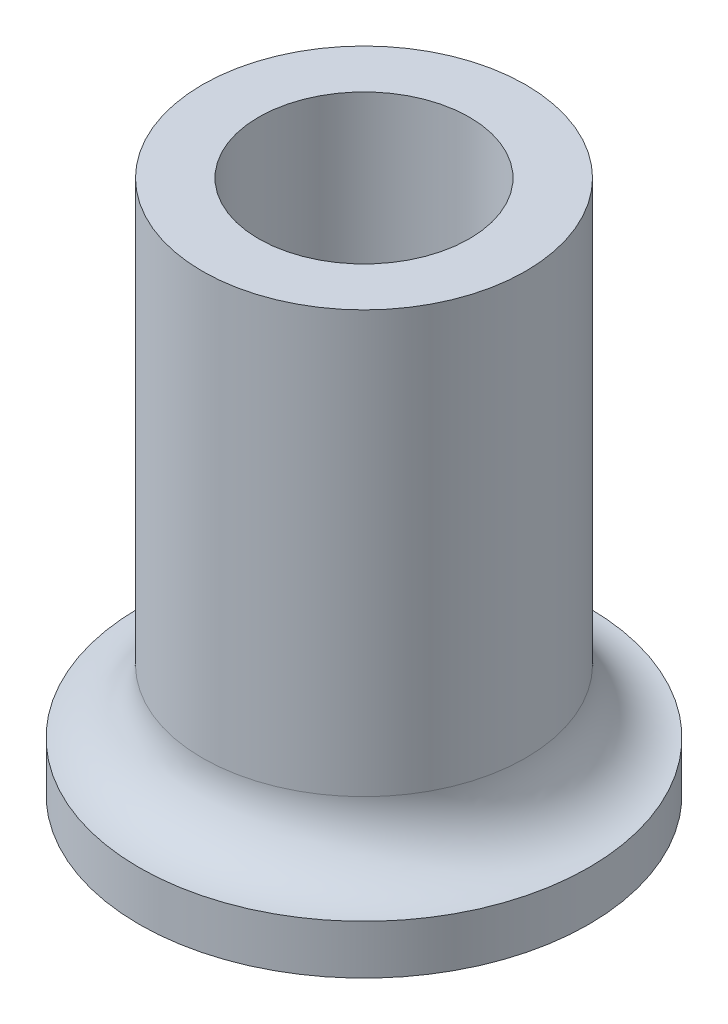
ISO-10303-21;
HEADER;
FILE_DESCRIPTION(('STEP AP214'),'2;1');
FILE_NAME('part.step','',(''),(''),'','','');
FILE_SCHEMA(('AUTOMOTIVE_DESIGN { 1 0 10303 214 1 1 1 1 }'));
ENDSEC;
DATA;
#1=APPLICATION_CONTEXT('core data for automotive mechanical design processes');
#2=APPLICATION_PROTOCOL_DEFINITION('international standard','automotive_design',2000,#1);
#3=PRODUCT_CONTEXT('',#1,'mechanical');
#4=PRODUCT('Part','Part','',(#3));
#5=PRODUCT_RELATED_PRODUCT_CATEGORY('part','',(#4));
#6=PRODUCT_DEFINITION_FORMATION('','',#4);
#7=PRODUCT_DEFINITION_CONTEXT('part definition',#1,'design');
#8=PRODUCT_DEFINITION('design','',#6,#7);
#9=PRODUCT_DEFINITION_SHAPE('','',#8);
#10=(LENGTH_UNIT() NAMED_UNIT(*) SI_UNIT(.MILLI.,.METRE.));
#11=(NAMED_UNIT(*) PLANE_ANGLE_UNIT() SI_UNIT($,.RADIAN.));
#12=(NAMED_UNIT(*) SI_UNIT($,.STERADIAN.) SOLID_ANGLE_UNIT());
#13=UNCERTAINTY_MEASURE_WITH_UNIT(LENGTH_MEASURE(1.E-05),#10,'distance_accuracy_value','');
#14=(GEOMETRIC_REPRESENTATION_CONTEXT(3) GLOBAL_UNCERTAINTY_ASSIGNED_CONTEXT((#13)) GLOBAL_UNIT_ASSIGNED_CONTEXT((#10,
#11,#12)) REPRESENTATION_CONTEXT('',''));
#15=CARTESIAN_POINT('',(0.,0.,0.));
#16=DIRECTION('',(0.,0.,1.));
#17=DIRECTION('',(1.,0.,0.));
#18=AXIS2_PLACEMENT_3D('',#15,#16,#17);
#19=CARTESIAN_POINT('',(0.,0.,0.));
#20=DIRECTION('',(0.,1.,0.));
#21=DIRECTION('',(0.,0.,1.));
#22=AXIS2_PLACEMENT_3D('',#19,#20,#21);
#23=PLANE('',#22);
#24=CARTESIAN_POINT('',(0.,0.,0.));
#25=DIRECTION('',(0.,1.,0.));
#26=DIRECTION('',(0.,0.,1.));
#27=AXIS2_PLACEMENT_3D('',#24,#25,#26);
#28=CIRCLE('',#27,16.);
#29=CARTESIAN_POINT('',(0.,0.,16.));
#30=VERTEX_POINT('',#29);
#31=EDGE_CURVE('E50',#30,#30,#28,.T.);
#32=ORIENTED_EDGE('',*,*,#31,.F.);
#33=EDGE_LOOP('',(#32));
#34=FACE_BOUND('',#33,.T.);
#35=CARTESIAN_POINT('',(0.,0.,0.));
#36=DIRECTION('',(0.,1.,0.));
#37=DIRECTION('',(0.,0.,1.));
#38=AXIS2_PLACEMENT_3D('',#35,#36,#37);
#39=CIRCLE('',#38,7.5);
#40=CARTESIAN_POINT('',(0.,0.,7.5));
#41=VERTEX_POINT('',#40);
#42=EDGE_CURVE('E56',#41,#41,#39,.T.);
#43=ORIENTED_EDGE('',*,*,#42,.T.);
#44=EDGE_LOOP('',(#43));
#45=FACE_BOUND('',#44,.T.);
#46=ADVANCED_FACE('F37',(#34,#45),#23,.F.);
#47=CARTESIAN_POINT('',(0.,3.5,0.));
#48=DIRECTION('',(0.,-1.,0.));
#49=DIRECTION('',(0.,0.,-1.));
#50=AXIS2_PLACEMENT_3D('',#47,#48,#49);
#51=CYLINDRICAL_SURFACE('',#50,16.);
#52=CARTESIAN_POINT('',(0.,3.5,0.));
#53=DIRECTION('',(0.,1.,0.));
#54=DIRECTION('',(0.,0.,1.));
#55=AXIS2_PLACEMENT_3D('',#52,#53,#54);
#56=CIRCLE('',#55,16.);
#57=CARTESIAN_POINT('',(0.,3.5,16.));
#58=VERTEX_POINT('',#57);
#59=EDGE_CURVE('E45',#58,#58,#56,.T.);
#60=ORIENTED_EDGE('',*,*,#59,.F.);
#61=EDGE_LOOP('',(#60));
#62=FACE_BOUND('',#61,.T.);
#63=ORIENTED_EDGE('',*,*,#31,.T.);
#64=EDGE_LOOP('',(#63));
#65=FACE_BOUND('',#64,.T.);
#66=ADVANCED_FACE('F82',(#62,#65),#51,.T.);
#67=CARTESIAN_POINT('',(0.,3.5,0.));
#68=DIRECTION('',(0.,-1.,0.));
#69=DIRECTION('',(0.,0.,-1.));
#70=AXIS2_PLACEMENT_3D('',#67,#68,#69);
#71=CYLINDRICAL_SURFACE('',#70,7.5);
#72=ORIENTED_EDGE('',*,*,#42,.F.);
#73=EDGE_LOOP('',(#72));
#74=FACE_BOUND('',#73,.T.);
#75=CARTESIAN_POINT('',(0.,38.,0.));
#76=DIRECTION('',(0.,1.,0.));
#77=DIRECTION('',(0.,0.,1.));
#78=AXIS2_PLACEMENT_3D('',#75,#76,#77);
#79=CIRCLE('',#78,7.5);
#80=CARTESIAN_POINT('',(0.,38.,7.5));
#81=VERTEX_POINT('',#80);
#82=EDGE_CURVE('E65',#81,#81,#79,.T.);
#83=ORIENTED_EDGE('',*,*,#82,.T.);
#84=EDGE_LOOP('',(#83));
#85=FACE_BOUND('',#84,.T.);
#86=ADVANCED_FACE('F70',(#74,#85),#71,.F.);
#87=CARTESIAN_POINT('',(0.,38.,0.));
#88=DIRECTION('',(0.,1.,0.));
#89=DIRECTION('',(0.,0.,1.));
#90=AXIS2_PLACEMENT_3D('',#87,#88,#89);
#91=PLANE('',#90);
#92=CARTESIAN_POINT('',(0.,38.,0.));
#93=DIRECTION('',(0.,1.,0.));
#94=DIRECTION('',(0.,0.,1.));
#95=AXIS2_PLACEMENT_3D('',#92,#93,#94);
#96=CIRCLE('',#95,11.5);
#97=CARTESIAN_POINT('',(0.,38.,11.5));
#98=VERTEX_POINT('',#97);
#99=EDGE_CURVE('E61',#98,#98,#96,.T.);
#100=ORIENTED_EDGE('',*,*,#99,.T.);
#101=EDGE_LOOP('',(#100));
#102=FACE_BOUND('',#101,.T.);
#103=ORIENTED_EDGE('',*,*,#82,.F.);
#104=EDGE_LOOP('',(#103));
#105=FACE_BOUND('',#104,.T.);
#106=ADVANCED_FACE('F72',(#102,#105),#91,.T.);
#107=CARTESIAN_POINT('',(0.,38.,0.));
#108=DIRECTION('',(0.,-1.,0.));
#109=DIRECTION('',(0.,0.,-1.));
#110=AXIS2_PLACEMENT_3D('',#107,#108,#109);
#111=CYLINDRICAL_SURFACE('',#110,11.5);
#112=CARTESIAN_POINT('',(0.,8.,0.));
#113=DIRECTION('',(0.,1.,0.));
#114=DIRECTION('',(0.,0.,1.));
#115=AXIS2_PLACEMENT_3D('',#112,#113,#114);
#116=CIRCLE('',#115,11.5);
#117=CARTESIAN_POINT('',(0.,8.,11.5));
#118=VERTEX_POINT('',#117);
#119=EDGE_CURVE('E10',#118,#118,#116,.T.);
#120=ORIENTED_EDGE('',*,*,#119,.T.);
#121=EDGE_LOOP('',(#120));
#122=FACE_BOUND('',#121,.T.);
#123=ORIENTED_EDGE('',*,*,#99,.F.);
#124=EDGE_LOOP('',(#123));
#125=FACE_BOUND('',#124,.T.);
#126=ADVANCED_FACE('F74',(#122,#125),#111,.T.);
#127=CARTESIAN_POINT('',(0.,8.,0.));
#128=DIRECTION('',(0.,1.,0.));
#129=DIRECTION('',(0.,0.,1.));
#130=AXIS2_PLACEMENT_3D('',#127,#128,#129);
#131=TOROIDAL_SURFACE('',#130,16.,4.5);
#132=ORIENTED_EDGE('',*,*,#59,.T.);
#133=EDGE_LOOP('',(#132));
#134=FACE_BOUND('',#133,.T.);
#135=ORIENTED_EDGE('',*,*,#119,.F.);
#136=EDGE_LOOP('',(#135));
#137=FACE_BOUND('',#136,.T.);
#138=ADVANCED_FACE('F39',(#134,#137),#131,.F.);
#139=CLOSED_SHELL('',(#46,#66,#86,#106,#126,#138));
#140=MANIFOLD_SOLID_BREP('B2',#139);
#141=ADVANCED_BREP_SHAPE_REPRESENTATION('',(#18,#140),#14);
#142=SHAPE_DEFINITION_REPRESENTATION(#9,#141);
ENDSEC;
END-ISO-10303-21;
